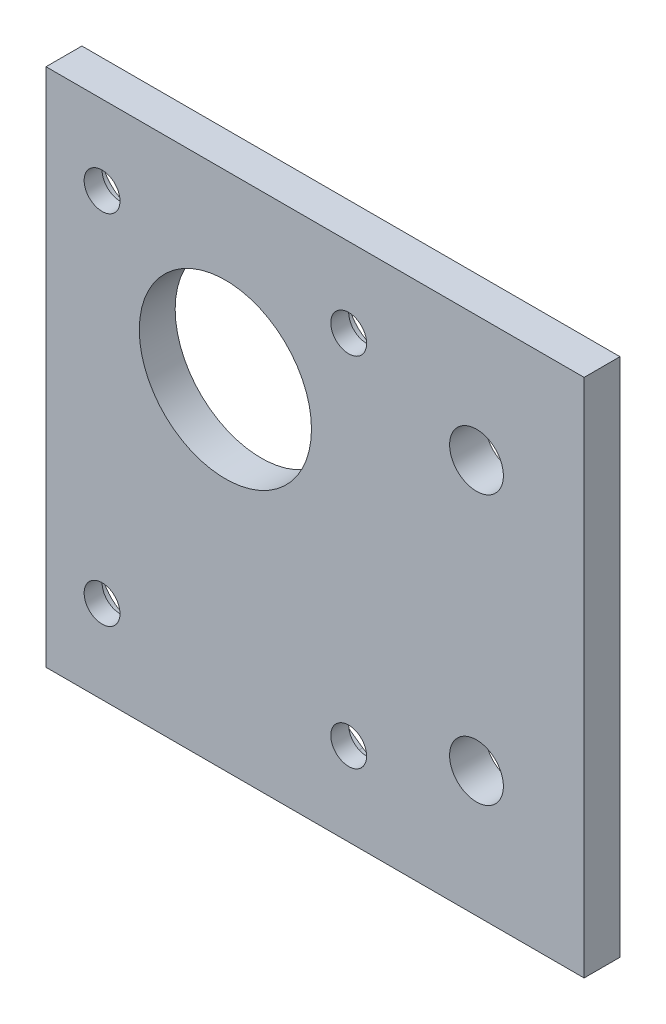
ISO-10303-21;
HEADER;
FILE_DESCRIPTION(('STEP AP214'),'2;1');
FILE_NAME('part.step','',(''),(''),'','','');
FILE_SCHEMA(('AUTOMOTIVE_DESIGN { 1 0 10303 214 1 1 1 1 }'));
ENDSEC;
DATA;
#1=APPLICATION_CONTEXT('core data for automotive mechanical design processes');
#2=APPLICATION_PROTOCOL_DEFINITION('international standard','automotive_design',2000,#1);
#3=PRODUCT_CONTEXT('',#1,'mechanical');
#4=PRODUCT('Part','Part','',(#3));
#5=PRODUCT_RELATED_PRODUCT_CATEGORY('part','',(#4));
#6=PRODUCT_DEFINITION_FORMATION('','',#4);
#7=PRODUCT_DEFINITION_CONTEXT('part definition',#1,'design');
#8=PRODUCT_DEFINITION('design','',#6,#7);
#9=PRODUCT_DEFINITION_SHAPE('','',#8);
#10=(LENGTH_UNIT() NAMED_UNIT(*) SI_UNIT(.MILLI.,.METRE.));
#11=(NAMED_UNIT(*) PLANE_ANGLE_UNIT() SI_UNIT($,.RADIAN.));
#12=(NAMED_UNIT(*) SI_UNIT($,.STERADIAN.) SOLID_ANGLE_UNIT());
#13=UNCERTAINTY_MEASURE_WITH_UNIT(LENGTH_MEASURE(1.E-05),#10,'distance_accuracy_value','');
#14=(GEOMETRIC_REPRESENTATION_CONTEXT(3) GLOBAL_UNCERTAINTY_ASSIGNED_CONTEXT((#13)) GLOBAL_UNIT_ASSIGNED_CONTEXT((#10,
#11,#12)) REPRESENTATION_CONTEXT('',''));
#15=CARTESIAN_POINT('',(0.,0.,0.));
#16=DIRECTION('',(0.,0.,1.));
#17=DIRECTION('',(1.,0.,0.));
#18=AXIS2_PLACEMENT_3D('',#15,#16,#17);
#19=CARTESIAN_POINT('',(0.,-29.,2.));
#20=DIRECTION('',(0.,-1.,0.));
#21=DIRECTION('',(0.,0.,-1.));
#22=AXIS2_PLACEMENT_3D('',#19,#20,#21);
#23=PLANE('',#22);
#24=DIRECTION('',(-1.,0.,0.));
#25=VECTOR('',#24,1.);
#26=CARTESIAN_POINT('',(0.,-29.,0.));
#27=LINE('',#26,#25);
#28=CARTESIAN_POINT('',(40.,-29.,0.));
#29=VERTEX_POINT('',#28);
#30=CARTESIAN_POINT('',(-20.,-29.,0.));
#31=VERTEX_POINT('',#30);
#32=EDGE_CURVE('E115',#29,#31,#27,.T.);
#33=ORIENTED_EDGE('',*,*,#32,.F.);
#34=DIRECTION('',(0.,0.,-1.));
#35=VECTOR('',#34,1.);
#36=CARTESIAN_POINT('',(40.,-29.,2.));
#37=LINE('',#36,#35);
#38=CARTESIAN_POINT('',(40.,-29.,4.));
#39=VERTEX_POINT('',#38);
#40=EDGE_CURVE('E11',#39,#29,#37,.T.);
#41=ORIENTED_EDGE('',*,*,#40,.F.);
#42=DIRECTION('',(1.,0.,0.));
#43=VECTOR('',#42,1.);
#44=CARTESIAN_POINT('',(-20.,-29.,4.));
#45=LINE('',#44,#43);
#46=CARTESIAN_POINT('',(-20.,-29.,4.));
#47=VERTEX_POINT('',#46);
#48=EDGE_CURVE('E114',#47,#39,#45,.T.);
#49=ORIENTED_EDGE('',*,*,#48,.F.);
#50=DIRECTION('',(0.,0.,-1.));
#51=VECTOR('',#50,1.);
#52=CARTESIAN_POINT('',(-20.,-29.,2.));
#53=LINE('',#52,#51);
#54=EDGE_CURVE('E94',#47,#31,#53,.T.);
#55=ORIENTED_EDGE('',*,*,#54,.T.);
#56=EDGE_LOOP('',(#33,#41,#49,#55));
#57=FACE_BOUND('',#56,.T.);
#58=ADVANCED_FACE('F39',(#57),#23,.T.);
#59=CARTESIAN_POINT('',(40.,0.,2.));
#60=DIRECTION('',(1.,0.,0.));
#61=DIRECTION('',(0.,1.,0.));
#62=AXIS2_PLACEMENT_3D('',#59,#60,#61);
#63=PLANE('',#62);
#64=DIRECTION('',(0.,-1.,0.));
#65=VECTOR('',#64,1.);
#66=CARTESIAN_POINT('',(40.,0.,0.));
#67=LINE('',#66,#65);
#68=CARTESIAN_POINT('',(40.,29.,0.));
#69=VERTEX_POINT('',#68);
#70=EDGE_CURVE('E197',#69,#29,#67,.T.);
#71=ORIENTED_EDGE('',*,*,#70,.F.);
#72=DIRECTION('',(0.,0.,-1.));
#73=VECTOR('',#72,1.);
#74=CARTESIAN_POINT('',(40.,29.,2.));
#75=LINE('',#74,#73);
#76=CARTESIAN_POINT('',(40.,29.,4.));
#77=VERTEX_POINT('',#76);
#78=EDGE_CURVE('E49',#77,#69,#75,.T.);
#79=ORIENTED_EDGE('',*,*,#78,.F.);
#80=DIRECTION('',(0.,1.,0.));
#81=VECTOR('',#80,1.);
#82=CARTESIAN_POINT('',(40.,-29.,4.));
#83=LINE('',#82,#81);
#84=EDGE_CURVE('E120',#39,#77,#83,.T.);
#85=ORIENTED_EDGE('',*,*,#84,.F.);
#86=ORIENTED_EDGE('',*,*,#40,.T.);
#87=EDGE_LOOP('',(#71,#79,#85,#86));
#88=FACE_BOUND('',#87,.T.);
#89=ADVANCED_FACE('F121',(#88),#63,.T.);
#90=CARTESIAN_POINT('',(0.,29.,2.));
#91=DIRECTION('',(0.,1.,0.));
#92=DIRECTION('',(-1.,0.,0.));
#93=AXIS2_PLACEMENT_3D('',#90,#91,#92);
#94=PLANE('',#93);
#95=DIRECTION('',(1.,0.,0.));
#96=VECTOR('',#95,1.);
#97=CARTESIAN_POINT('',(0.,29.,0.));
#98=LINE('',#97,#96);
#99=CARTESIAN_POINT('',(-20.,29.,0.));
#100=VERTEX_POINT('',#99);
#101=EDGE_CURVE('E199',#100,#69,#98,.T.);
#102=ORIENTED_EDGE('',*,*,#101,.F.);
#103=DIRECTION('',(0.,0.,-1.));
#104=VECTOR('',#103,1.);
#105=CARTESIAN_POINT('',(-20.,29.,2.));
#106=LINE('',#105,#104);
#107=CARTESIAN_POINT('',(-20.,29.,4.));
#108=VERTEX_POINT('',#107);
#109=EDGE_CURVE('E87',#108,#100,#106,.T.);
#110=ORIENTED_EDGE('',*,*,#109,.F.);
#111=DIRECTION('',(-1.,0.,0.));
#112=VECTOR('',#111,1.);
#113=CARTESIAN_POINT('',(-20.,29.,4.));
#114=LINE('',#113,#112);
#115=EDGE_CURVE('E125',#77,#108,#114,.T.);
#116=ORIENTED_EDGE('',*,*,#115,.F.);
#117=ORIENTED_EDGE('',*,*,#78,.T.);
#118=EDGE_LOOP('',(#102,#110,#116,#117));
#119=FACE_BOUND('',#118,.T.);
#120=ADVANCED_FACE('F238',(#119),#94,.T.);
#121=CARTESIAN_POINT('',(9.67691762911674,-16.8,2.));
#122=DIRECTION('',(0.,0.,-1.));
#123=DIRECTION('',(-1.,0.,0.));
#124=AXIS2_PLACEMENT_3D('',#121,#122,#123);
#125=CYLINDRICAL_SURFACE('',#124,4.2);
#126=CARTESIAN_POINT('',(9.67691762911674,-16.8,0.));
#127=DIRECTION('',(0.,0.,1.));
#128=DIRECTION('',(1.,0.,0.));
#129=AXIS2_PLACEMENT_3D('',#126,#127,#128);
#130=CIRCLE('',#129,4.2);
#131=CARTESIAN_POINT('',(12.1129176291167,-13.378610808458,0.));
#132=VERTEX_POINT('',#131);
#133=CARTESIAN_POINT('',(7.24091762911674,-20.2213891915419,0.));
#134=VERTEX_POINT('',#133);
#135=EDGE_CURVE('E175',#132,#134,#130,.T.);
#136=ORIENTED_EDGE('',*,*,#135,.F.);
#137=DIRECTION('',(0.,0.,-1.));
#138=VECTOR('',#137,1.);
#139=CARTESIAN_POINT('',(12.1129176291167,-13.378610808458,2.));
#140=LINE('',#139,#138);
#141=CARTESIAN_POINT('',(12.1129176291167,-13.378610808458,2.));
#142=VERTEX_POINT('',#141);
#143=EDGE_CURVE('E43',#142,#132,#140,.T.);
#144=ORIENTED_EDGE('',*,*,#143,.F.);
#145=CARTESIAN_POINT('',(9.67691762911674,-16.8,2.));
#146=DIRECTION('',(0.,0.,1.));
#147=DIRECTION('',(1.,0.,0.));
#148=AXIS2_PLACEMENT_3D('',#145,#146,#147);
#149=CIRCLE('',#148,4.2);
#150=CARTESIAN_POINT('',(7.24091762911674,-20.2213891915419,2.));
#151=VERTEX_POINT('',#150);
#152=EDGE_CURVE('E149',#142,#151,#149,.T.);
#153=ORIENTED_EDGE('',*,*,#152,.T.);
#154=DIRECTION('',(0.,0.,-1.));
#155=VECTOR('',#154,1.);
#156=CARTESIAN_POINT('',(7.24091762911674,-20.2213891915419,2.));
#157=LINE('',#156,#155);
#158=EDGE_CURVE('E159',#151,#134,#157,.T.);
#159=ORIENTED_EDGE('',*,*,#158,.T.);
#160=EDGE_LOOP('',(#136,#144,#153,#159));
#161=FACE_BOUND('',#160,.T.);
#162=ADVANCED_FACE('F214',(#161),#125,.F.);
#163=CARTESIAN_POINT('',(-2.24630783394243,-3.15496442689926,2.));
#164=DIRECTION('',(-0.58,-0.814616474176652,0.));
#165=DIRECTION('',(0.814616474176652,-0.58,0.));
#166=AXIS2_PLACEMENT_3D('',#163,#164,#165);
#167=PLANE('',#166);
#168=DIRECTION('',(-0.814616474176652,0.58,0.));
#169=VECTOR('',#168,1.);
#170=CARTESIAN_POINT('',(-2.24630783394243,-3.15496442689926,0.));
#171=LINE('',#170,#169);
#172=CARTESIAN_POINT('',(16.186,-16.2786108084581,0.));
#173=VERTEX_POINT('',#172);
#174=EDGE_CURVE('E178',#173,#132,#171,.T.);
#175=ORIENTED_EDGE('',*,*,#174,.F.);
#176=DIRECTION('',(0.,0.,-1.));
#177=VECTOR('',#176,1.);
#178=CARTESIAN_POINT('',(16.186,-16.2786108084581,2.));
#179=LINE('',#178,#177);
#180=CARTESIAN_POINT('',(16.186,-16.2786108084581,2.));
#181=VERTEX_POINT('',#180);
#182=EDGE_CURVE('E208',#181,#173,#179,.T.);
#183=ORIENTED_EDGE('',*,*,#182,.F.);
#184=DIRECTION('',(-0.814616474176652,0.58,0.));
#185=VECTOR('',#184,1.);
#186=CARTESIAN_POINT('',(-2.24630783394243,-3.15496442689926,2.));
#187=LINE('',#186,#185);
#188=EDGE_CURVE('E151',#181,#142,#187,.T.);
#189=ORIENTED_EDGE('',*,*,#188,.T.);
#190=ORIENTED_EDGE('',*,*,#143,.T.);
#191=EDGE_LOOP('',(#175,#183,#189,#190));
#192=FACE_BOUND('',#191,.T.);
#193=ADVANCED_FACE('F211',(#192),#167,.T.);
#194=CARTESIAN_POINT('',(13.75,-19.7,2.));
#195=DIRECTION('',(0.,0.,-1.));
#196=DIRECTION('',(-1.,0.,0.));
#197=AXIS2_PLACEMENT_3D('',#194,#195,#196);
#198=CYLINDRICAL_SURFACE('',#197,4.2);
#199=CARTESIAN_POINT('',(13.75,-19.7,0.));
#200=DIRECTION('',(0.,0.,1.));
#201=DIRECTION('',(1.,0.,0.));
#202=AXIS2_PLACEMENT_3D('',#199,#200,#201);
#203=CIRCLE('',#202,4.2);
#204=CARTESIAN_POINT('',(11.314,-23.1213891915419,0.));
#205=VERTEX_POINT('',#204);
#206=EDGE_CURVE('E181',#205,#173,#203,.T.);
#207=ORIENTED_EDGE('',*,*,#206,.F.);
#208=DIRECTION('',(0.,0.,-1.));
#209=VECTOR('',#208,1.);
#210=CARTESIAN_POINT('',(11.314,-23.1213891915419,2.));
#211=LINE('',#210,#209);
#212=CARTESIAN_POINT('',(11.314,-23.1213891915419,2.));
#213=VERTEX_POINT('',#212);
#214=EDGE_CURVE('E58',#213,#205,#211,.T.);
#215=ORIENTED_EDGE('',*,*,#214,.F.);
#216=CARTESIAN_POINT('',(13.75,-19.7,2.));
#217=DIRECTION('',(0.,0.,1.));
#218=DIRECTION('',(1.,0.,0.));
#219=AXIS2_PLACEMENT_3D('',#216,#217,#218);
#220=CIRCLE('',#219,4.2);
#221=EDGE_CURVE('E154',#213,#181,#220,.T.);
#222=ORIENTED_EDGE('',*,*,#221,.T.);
#223=ORIENTED_EDGE('',*,*,#182,.T.);
#224=EDGE_LOOP('',(#207,#215,#222,#223));
#225=FACE_BOUND('',#224,.T.);
#226=ADVANCED_FACE('F220',(#225),#198,.F.);
#227=CARTESIAN_POINT('',(-13.75,20.15,2.));
#228=DIRECTION('',(0.,0.,-1.));
#229=DIRECTION('',(-1.,0.,0.));
#230=AXIS2_PLACEMENT_3D('',#227,#228,#229);
#231=CYLINDRICAL_SURFACE('',#230,4.2);
#232=CARTESIAN_POINT('',(-13.75,20.15,2.));
#233=DIRECTION('',(0.,0.,1.));
#234=DIRECTION('',(1.,0.,0.));
#235=AXIS2_PLACEMENT_3D('',#232,#233,#234);
#236=CIRCLE('',#235,4.2);
#237=CARTESIAN_POINT('',(-9.55,20.15,2.));
#238=VERTEX_POINT('',#237);
#239=EDGE_CURVE('E140',#238,#238,#236,.T.);
#240=ORIENTED_EDGE('',*,*,#239,.T.);
#241=EDGE_LOOP('',(#240));
#242=FACE_BOUND('',#241,.T.);
#243=CARTESIAN_POINT('',(-13.75,20.15,0.));
#244=DIRECTION('',(0.,0.,1.));
#245=DIRECTION('',(1.,0.,0.));
#246=AXIS2_PLACEMENT_3D('',#243,#244,#245);
#247=CIRCLE('',#246,4.2);
#248=CARTESIAN_POINT('',(-9.55,20.15,0.));
#249=VERTEX_POINT('',#248);
#250=EDGE_CURVE('E193',#249,#249,#247,.T.);
#251=ORIENTED_EDGE('',*,*,#250,.F.);
#252=EDGE_LOOP('',(#251));
#253=FACE_BOUND('',#252,.T.);
#254=ADVANCED_FACE('F222',(#242,#253),#231,.F.);
#255=CARTESIAN_POINT('',(13.75,20.15,2.));
#256=DIRECTION('',(0.,0.,-1.));
#257=DIRECTION('',(-1.,0.,0.));
#258=AXIS2_PLACEMENT_3D('',#255,#256,#257);
#259=CYLINDRICAL_SURFACE('',#258,4.19999999999999);
#260=CARTESIAN_POINT('',(13.75,20.15,2.));
#261=DIRECTION('',(0.,0.,1.));
#262=DIRECTION('',(1.,0.,0.));
#263=AXIS2_PLACEMENT_3D('',#260,#261,#262);
#264=CIRCLE('',#263,4.19999999999999);
#265=CARTESIAN_POINT('',(17.95,20.15,2.));
#266=VERTEX_POINT('',#265);
#267=EDGE_CURVE('E162',#266,#266,#264,.T.);
#268=ORIENTED_EDGE('',*,*,#267,.T.);
#269=EDGE_LOOP('',(#268));
#270=FACE_BOUND('',#269,.T.);
#271=CARTESIAN_POINT('',(13.75,20.15,0.));
#272=DIRECTION('',(0.,0.,1.));
#273=DIRECTION('',(1.,0.,0.));
#274=AXIS2_PLACEMENT_3D('',#271,#272,#273);
#275=CIRCLE('',#274,4.19999999999999);
#276=CARTESIAN_POINT('',(17.95,20.15,0.));
#277=VERTEX_POINT('',#276);
#278=EDGE_CURVE('E190',#277,#277,#275,.T.);
#279=ORIENTED_EDGE('',*,*,#278,.F.);
#280=EDGE_LOOP('',(#279));
#281=FACE_BOUND('',#280,.T.);
#282=ADVANCED_FACE('F228',(#270,#281),#259,.F.);
#283=CARTESIAN_POINT('',(-13.75,-19.7,2.));
#284=DIRECTION('',(0.,0.,-1.));
#285=DIRECTION('',(-1.,0.,0.));
#286=AXIS2_PLACEMENT_3D('',#283,#284,#285);
#287=CYLINDRICAL_SURFACE('',#286,4.2);
#288=CARTESIAN_POINT('',(-13.75,-19.7,2.));
#289=DIRECTION('',(0.,0.,1.));
#290=DIRECTION('',(1.,0.,0.));
#291=AXIS2_PLACEMENT_3D('',#288,#289,#290);
#292=CIRCLE('',#291,4.2);
#293=CARTESIAN_POINT('',(-9.55,-19.7,2.));
#294=VERTEX_POINT('',#293);
#295=EDGE_CURVE('E148',#294,#294,#292,.T.);
#296=ORIENTED_EDGE('',*,*,#295,.T.);
#297=EDGE_LOOP('',(#296));
#298=FACE_BOUND('',#297,.T.);
#299=CARTESIAN_POINT('',(-13.75,-19.7,0.));
#300=DIRECTION('',(0.,0.,1.));
#301=DIRECTION('',(1.,0.,0.));
#302=AXIS2_PLACEMENT_3D('',#299,#300,#301);
#303=CIRCLE('',#302,4.2);
#304=CARTESIAN_POINT('',(-9.55,-19.7,0.));
#305=VERTEX_POINT('',#304);
#306=EDGE_CURVE('E187',#305,#305,#303,.T.);
#307=ORIENTED_EDGE('',*,*,#306,.F.);
#308=EDGE_LOOP('',(#307));
#309=FACE_BOUND('',#308,.T.);
#310=ADVANCED_FACE('F244',(#298,#309),#287,.F.);
#311=CARTESIAN_POINT('',(-7.11830783394242,-9.99774280998307,2.));
#312=DIRECTION('',(-0.580000000000002,-0.81461647417665,0.));
#313=DIRECTION('',(0.814616474176651,-0.580000000000002,0.));
#314=AXIS2_PLACEMENT_3D('',#311,#312,#313);
#315=PLANE('',#314);
#316=DIRECTION('',(-0.814616474176651,0.580000000000002,0.));
#317=VECTOR('',#316,1.);
#318=CARTESIAN_POINT('',(-7.11830783394242,-9.99774280998307,0.));
#319=LINE('',#318,#317);
#320=EDGE_CURVE('E184',#205,#134,#319,.T.);
#321=ORIENTED_EDGE('',*,*,#320,.T.);
#322=ORIENTED_EDGE('',*,*,#158,.F.);
#323=DIRECTION('',(-0.814616474176651,0.580000000000002,0.));
#324=VECTOR('',#323,1.);
#325=CARTESIAN_POINT('',(-7.11830783394242,-9.99774280998307,2.));
#326=LINE('',#325,#324);
#327=EDGE_CURVE('E156',#213,#151,#326,.T.);
#328=ORIENTED_EDGE('',*,*,#327,.F.);
#329=ORIENTED_EDGE('',*,*,#214,.T.);
#330=EDGE_LOOP('',(#321,#322,#328,#329));
#331=FACE_BOUND('',#330,.T.);
#332=ADVANCED_FACE('F247',(#331),#315,.F.);
#333=CARTESIAN_POINT('',(0.,8.80000000000001,2.));
#334=DIRECTION('',(0.,0.,-1.));
#335=DIRECTION('',(-1.,0.,0.));
#336=AXIS2_PLACEMENT_3D('',#333,#334,#335);
#337=CYLINDRICAL_SURFACE('',#336,9.6);
#338=CARTESIAN_POINT('',(0.,8.80000000000001,0.));
#339=DIRECTION('',(0.,0.,1.));
#340=DIRECTION('',(1.,0.,0.));
#341=AXIS2_PLACEMENT_3D('',#338,#339,#340);
#342=CIRCLE('',#341,9.6);
#343=CARTESIAN_POINT('',(9.6,8.80000000000001,0.));
#344=VERTEX_POINT('',#343);
#345=EDGE_CURVE('E172',#344,#344,#342,.T.);
#346=ORIENTED_EDGE('',*,*,#345,.F.);
#347=EDGE_LOOP('',(#346));
#348=FACE_BOUND('',#347,.T.);
#349=CARTESIAN_POINT('',(0.,8.80000000000001,4.));
#350=DIRECTION('',(0.,0.,1.));
#351=DIRECTION('',(1.,0.,0.));
#352=AXIS2_PLACEMENT_3D('',#349,#350,#351);
#353=CIRCLE('',#352,9.6);
#354=CARTESIAN_POINT('',(9.6,8.80000000000001,4.));
#355=VERTEX_POINT('',#354);
#356=EDGE_CURVE('E312',#355,#355,#353,.T.);
#357=ORIENTED_EDGE('',*,*,#356,.T.);
#358=EDGE_LOOP('',(#357));
#359=FACE_BOUND('',#358,.T.);
#360=ADVANCED_FACE('F250',(#348,#359),#337,.F.);
#361=CARTESIAN_POINT('',(-5.725,-6.09999999999999,2.));
#362=DIRECTION('',(0.,0.,-1.));
#363=DIRECTION('',(-1.,0.,0.));
#364=AXIS2_PLACEMENT_3D('',#361,#362,#363);
#365=CYLINDRICAL_SURFACE('',#364,4.2);
#366=CARTESIAN_POINT('',(-5.725,-6.09999999999999,2.));
#367=DIRECTION('',(0.,0.,1.));
#368=DIRECTION('',(1.,0.,0.));
#369=AXIS2_PLACEMENT_3D('',#366,#367,#368);
#370=CIRCLE('',#369,4.2);
#371=CARTESIAN_POINT('',(-1.525,-6.09999999999999,2.));
#372=VERTEX_POINT('',#371);
#373=EDGE_CURVE('E145',#372,#372,#370,.T.);
#374=ORIENTED_EDGE('',*,*,#373,.T.);
#375=EDGE_LOOP('',(#374));
#376=FACE_BOUND('',#375,.T.);
#377=CARTESIAN_POINT('',(-5.725,-6.09999999999999,0.));
#378=DIRECTION('',(0.,0.,1.));
#379=DIRECTION('',(1.,0.,0.));
#380=AXIS2_PLACEMENT_3D('',#377,#378,#379);
#381=CIRCLE('',#380,4.2);
#382=CARTESIAN_POINT('',(-1.525,-6.09999999999999,0.));
#383=VERTEX_POINT('',#382);
#384=EDGE_CURVE('E169',#383,#383,#381,.T.);
#385=ORIENTED_EDGE('',*,*,#384,.F.);
#386=EDGE_LOOP('',(#385));
#387=FACE_BOUND('',#386,.T.);
#388=ADVANCED_FACE('F255',(#376,#387),#365,.F.);
#389=CARTESIAN_POINT('',(5.725,-6.09999999999999,2.));
#390=DIRECTION('',(0.,0.,-1.));
#391=DIRECTION('',(-1.,0.,0.));
#392=AXIS2_PLACEMENT_3D('',#389,#390,#391);
#393=CYLINDRICAL_SURFACE('',#392,4.2);
#394=CARTESIAN_POINT('',(5.725,-6.09999999999999,2.));
#395=DIRECTION('',(0.,0.,1.));
#396=DIRECTION('',(1.,0.,0.));
#397=AXIS2_PLACEMENT_3D('',#394,#395,#396);
#398=CIRCLE('',#397,4.2);
#399=CARTESIAN_POINT('',(9.925,-6.09999999999999,2.));
#400=VERTEX_POINT('',#399);
#401=EDGE_CURVE('E141',#400,#400,#398,.T.);
#402=ORIENTED_EDGE('',*,*,#401,.T.);
#403=EDGE_LOOP('',(#402));
#404=FACE_BOUND('',#403,.T.);
#405=CARTESIAN_POINT('',(5.725,-6.09999999999999,0.));
#406=DIRECTION('',(0.,0.,1.));
#407=DIRECTION('',(1.,0.,0.));
#408=AXIS2_PLACEMENT_3D('',#405,#406,#407);
#409=CIRCLE('',#408,4.2);
#410=CARTESIAN_POINT('',(9.925,-6.09999999999999,0.));
#411=VERTEX_POINT('',#410);
#412=EDGE_CURVE('E144',#411,#411,#409,.T.);
#413=ORIENTED_EDGE('',*,*,#412,.F.);
#414=EDGE_LOOP('',(#413));
#415=FACE_BOUND('',#414,.T.);
#416=ADVANCED_FACE('F41',(#404,#415),#393,.F.);
#417=CARTESIAN_POINT('',(-20.,0.,2.));
#418=DIRECTION('',(-1.,0.,0.));
#419=DIRECTION('',(0.,0.,1.));
#420=AXIS2_PLACEMENT_3D('',#417,#418,#419);
#421=PLANE('',#420);
#422=DIRECTION('',(0.,1.,0.));
#423=VECTOR('',#422,1.);
#424=CARTESIAN_POINT('',(-20.,0.,0.));
#425=LINE('',#424,#423);
#426=EDGE_CURVE('E152',#31,#100,#425,.T.);
#427=ORIENTED_EDGE('',*,*,#426,.F.);
#428=ORIENTED_EDGE('',*,*,#54,.F.);
#429=DIRECTION('',(0.,-1.,0.));
#430=VECTOR('',#429,1.);
#431=CARTESIAN_POINT('',(-20.,29.,4.));
#432=LINE('',#431,#430);
#433=EDGE_CURVE('E130',#108,#47,#432,.T.);
#434=ORIENTED_EDGE('',*,*,#433,.F.);
#435=ORIENTED_EDGE('',*,*,#109,.T.);
#436=EDGE_LOOP('',(#427,#428,#434,#435));
#437=FACE_BOUND('',#436,.T.);
#438=ADVANCED_FACE('F285',(#437),#421,.T.);
#439=CARTESIAN_POINT('',(0.,0.,0.));
#440=DIRECTION('',(0.,0.,1.));
#441=DIRECTION('',(1.,0.,0.));
#442=AXIS2_PLACEMENT_3D('',#439,#440,#441);
#443=PLANE('',#442);
#444=CARTESIAN_POINT('',(28.,15.,0.));
#445=DIRECTION('',(0.,0.,1.));
#446=DIRECTION('',(1.,0.,0.));
#447=AXIS2_PLACEMENT_3D('',#444,#445,#446);
#448=CIRCLE('',#447,3.);
#449=CARTESIAN_POINT('',(31.,15.,0.));
#450=VERTEX_POINT('',#449);
#451=EDGE_CURVE('E315',#450,#450,#448,.F.);
#452=ORIENTED_EDGE('',*,*,#451,.F.);
#453=EDGE_LOOP('',(#452));
#454=FACE_BOUND('',#453,.T.);
#455=CARTESIAN_POINT('',(28.,-15.,0.));
#456=DIRECTION('',(0.,0.,1.));
#457=DIRECTION('',(1.,0.,0.));
#458=AXIS2_PLACEMENT_3D('',#455,#456,#457);
#459=CIRCLE('',#458,3.);
#460=CARTESIAN_POINT('',(31.,-15.,0.));
#461=VERTEX_POINT('',#460);
#462=EDGE_CURVE('E324',#461,#461,#459,.F.);
#463=ORIENTED_EDGE('',*,*,#462,.F.);
#464=EDGE_LOOP('',(#463));
#465=FACE_BOUND('',#464,.T.);
#466=ORIENTED_EDGE('',*,*,#412,.T.);
#467=EDGE_LOOP('',(#466));
#468=FACE_BOUND('',#467,.T.);
#469=ORIENTED_EDGE('',*,*,#384,.T.);
#470=EDGE_LOOP('',(#469));
#471=FACE_BOUND('',#470,.T.);
#472=ORIENTED_EDGE('',*,*,#345,.T.);
#473=EDGE_LOOP('',(#472));
#474=FACE_BOUND('',#473,.T.);
#475=ORIENTED_EDGE('',*,*,#135,.T.);
#476=ORIENTED_EDGE('',*,*,#320,.F.);
#477=ORIENTED_EDGE('',*,*,#206,.T.);
#478=ORIENTED_EDGE('',*,*,#174,.T.);
#479=EDGE_LOOP('',(#475,#476,#477,#478));
#480=FACE_BOUND('',#479,.T.);
#481=ORIENTED_EDGE('',*,*,#306,.T.);
#482=EDGE_LOOP('',(#481));
#483=FACE_BOUND('',#482,.T.);
#484=ORIENTED_EDGE('',*,*,#278,.T.);
#485=EDGE_LOOP('',(#484));
#486=FACE_BOUND('',#485,.T.);
#487=ORIENTED_EDGE('',*,*,#250,.T.);
#488=EDGE_LOOP('',(#487));
#489=FACE_BOUND('',#488,.T.);
#490=ORIENTED_EDGE('',*,*,#32,.T.);
#491=ORIENTED_EDGE('',*,*,#426,.T.);
#492=ORIENTED_EDGE('',*,*,#101,.T.);
#493=ORIENTED_EDGE('',*,*,#70,.T.);
#494=EDGE_LOOP('',(#490,#491,#492,#493));
#495=FACE_BOUND('',#494,.T.);
#496=ADVANCED_FACE('F218',(#454,#465,#468,#471,#474,#480,#483,#486,#489,#495),#443,.F.);
#497=CARTESIAN_POINT('',(13.75,-19.7,4.));
#498=DIRECTION('',(0.,0.,-1.));
#499=DIRECTION('',(-1.,0.,0.));
#500=AXIS2_PLACEMENT_3D('',#497,#498,#499);
#501=CYLINDRICAL_SURFACE('',#500,2.00000000000001);
#502=CARTESIAN_POINT('',(13.75,-19.7,4.));
#503=DIRECTION('',(0.,0.,1.));
#504=DIRECTION('',(1.,0.,0.));
#505=AXIS2_PLACEMENT_3D('',#502,#503,#504);
#506=CIRCLE('',#505,2.00000000000001);
#507=CARTESIAN_POINT('',(15.75,-19.7,4.));
#508=VERTEX_POINT('',#507);
#509=EDGE_CURVE('E317',#508,#508,#506,.T.);
#510=ORIENTED_EDGE('',*,*,#509,.T.);
#511=EDGE_LOOP('',(#510));
#512=FACE_BOUND('',#511,.T.);
#513=CARTESIAN_POINT('',(13.75,-19.7,2.));
#514=DIRECTION('',(0.,0.,1.));
#515=DIRECTION('',(1.,0.,0.));
#516=AXIS2_PLACEMENT_3D('',#513,#514,#515);
#517=CIRCLE('',#516,2.00000000000001);
#518=CARTESIAN_POINT('',(15.75,-19.7,2.));
#519=VERTEX_POINT('',#518);
#520=EDGE_CURVE('E314',#519,#519,#517,.T.);
#521=ORIENTED_EDGE('',*,*,#520,.F.);
#522=EDGE_LOOP('',(#521));
#523=FACE_BOUND('',#522,.T.);
#524=ADVANCED_FACE('F284',(#512,#523),#501,.F.);
#525=CARTESIAN_POINT('',(13.75,20.15,4.));
#526=DIRECTION('',(0.,0.,-1.));
#527=DIRECTION('',(-1.,0.,0.));
#528=AXIS2_PLACEMENT_3D('',#525,#526,#527);
#529=CYLINDRICAL_SURFACE('',#528,2.);
#530=CARTESIAN_POINT('',(13.75,20.15,4.));
#531=DIRECTION('',(0.,0.,1.));
#532=DIRECTION('',(1.,0.,0.));
#533=AXIS2_PLACEMENT_3D('',#530,#531,#532);
#534=CIRCLE('',#533,2.);
#535=CARTESIAN_POINT('',(15.75,20.15,4.));
#536=VERTEX_POINT('',#535);
#537=EDGE_CURVE('E329',#536,#536,#534,.T.);
#538=ORIENTED_EDGE('',*,*,#537,.T.);
#539=EDGE_LOOP('',(#538));
#540=FACE_BOUND('',#539,.T.);
#541=CARTESIAN_POINT('',(13.75,20.15,2.));
#542=DIRECTION('',(0.,0.,1.));
#543=DIRECTION('',(1.,0.,0.));
#544=AXIS2_PLACEMENT_3D('',#541,#542,#543);
#545=CIRCLE('',#544,2.);
#546=CARTESIAN_POINT('',(15.75,20.15,2.));
#547=VERTEX_POINT('',#546);
#548=EDGE_CURVE('E327',#547,#547,#545,.T.);
#549=ORIENTED_EDGE('',*,*,#548,.F.);
#550=EDGE_LOOP('',(#549));
#551=FACE_BOUND('',#550,.T.);
#552=ADVANCED_FACE('F346',(#540,#551),#529,.F.);
#553=CARTESIAN_POINT('',(-13.75,20.15,4.));
#554=DIRECTION('',(0.,0.,-1.));
#555=DIRECTION('',(-1.,0.,0.));
#556=AXIS2_PLACEMENT_3D('',#553,#554,#555);
#557=CYLINDRICAL_SURFACE('',#556,2.);
#558=CARTESIAN_POINT('',(-13.75,20.15,4.));
#559=DIRECTION('',(0.,0.,1.));
#560=DIRECTION('',(1.,0.,0.));
#561=AXIS2_PLACEMENT_3D('',#558,#559,#560);
#562=CIRCLE('',#561,2.);
#563=CARTESIAN_POINT('',(-11.75,20.15,4.));
#564=VERTEX_POINT('',#563);
#565=EDGE_CURVE('E335',#564,#564,#562,.T.);
#566=ORIENTED_EDGE('',*,*,#565,.T.);
#567=EDGE_LOOP('',(#566));
#568=FACE_BOUND('',#567,.T.);
#569=CARTESIAN_POINT('',(-13.75,20.15,2.));
#570=DIRECTION('',(0.,0.,1.));
#571=DIRECTION('',(1.,0.,0.));
#572=AXIS2_PLACEMENT_3D('',#569,#570,#571);
#573=CIRCLE('',#572,2.);
#574=CARTESIAN_POINT('',(-11.75,20.15,2.));
#575=VERTEX_POINT('',#574);
#576=EDGE_CURVE('E332',#575,#575,#573,.T.);
#577=ORIENTED_EDGE('',*,*,#576,.F.);
#578=EDGE_LOOP('',(#577));
#579=FACE_BOUND('',#578,.T.);
#580=ADVANCED_FACE('F343',(#568,#579),#557,.F.);
#581=CARTESIAN_POINT('',(-13.75,-19.7,4.));
#582=DIRECTION('',(0.,0.,-1.));
#583=DIRECTION('',(-1.,0.,0.));
#584=AXIS2_PLACEMENT_3D('',#581,#582,#583);
#585=CYLINDRICAL_SURFACE('',#584,2.);
#586=CARTESIAN_POINT('',(-13.75,-19.7,4.));
#587=DIRECTION('',(0.,0.,1.));
#588=DIRECTION('',(1.,0.,0.));
#589=AXIS2_PLACEMENT_3D('',#586,#587,#588);
#590=CIRCLE('',#589,2.);
#591=CARTESIAN_POINT('',(-11.75,-19.7,4.));
#592=VERTEX_POINT('',#591);
#593=EDGE_CURVE('E131',#592,#592,#590,.T.);
#594=ORIENTED_EDGE('',*,*,#593,.T.);
#595=EDGE_LOOP('',(#594));
#596=FACE_BOUND('',#595,.T.);
#597=CARTESIAN_POINT('',(-13.75,-19.7,2.));
#598=DIRECTION('',(0.,0.,1.));
#599=DIRECTION('',(1.,0.,0.));
#600=AXIS2_PLACEMENT_3D('',#597,#598,#599);
#601=CIRCLE('',#600,2.);
#602=CARTESIAN_POINT('',(-11.75,-19.7,2.));
#603=VERTEX_POINT('',#602);
#604=EDGE_CURVE('E134',#603,#603,#601,.T.);
#605=ORIENTED_EDGE('',*,*,#604,.F.);
#606=EDGE_LOOP('',(#605));
#607=FACE_BOUND('',#606,.T.);
#608=ADVANCED_FACE('F345',(#596,#607),#585,.F.);
#609=CARTESIAN_POINT('',(0.,0.,4.));
#610=DIRECTION('',(0.,0.,1.));
#611=DIRECTION('',(1.,0.,0.));
#612=AXIS2_PLACEMENT_3D('',#609,#610,#611);
#613=PLANE('',#612);
#614=CARTESIAN_POINT('',(28.,15.,4.));
#615=DIRECTION('',(0.,0.,1.));
#616=DIRECTION('',(1.,0.,0.));
#617=AXIS2_PLACEMENT_3D('',#614,#615,#616);
#618=CIRCLE('',#617,3.);
#619=CARTESIAN_POINT('',(31.,15.,4.));
#620=VERTEX_POINT('',#619);
#621=EDGE_CURVE('E320',#620,#620,#618,.T.);
#622=ORIENTED_EDGE('',*,*,#621,.F.);
#623=EDGE_LOOP('',(#622));
#624=FACE_BOUND('',#623,.T.);
#625=CARTESIAN_POINT('',(28.,-15.,4.));
#626=DIRECTION('',(0.,0.,1.));
#627=DIRECTION('',(1.,0.,0.));
#628=AXIS2_PLACEMENT_3D('',#625,#626,#627);
#629=CIRCLE('',#628,3.);
#630=CARTESIAN_POINT('',(31.,-15.,4.));
#631=VERTEX_POINT('',#630);
#632=EDGE_CURVE('E375',#631,#631,#629,.T.);
#633=ORIENTED_EDGE('',*,*,#632,.F.);
#634=EDGE_LOOP('',(#633));
#635=FACE_BOUND('',#634,.T.);
#636=ORIENTED_EDGE('',*,*,#509,.F.);
#637=EDGE_LOOP('',(#636));
#638=FACE_BOUND('',#637,.T.);
#639=ORIENTED_EDGE('',*,*,#565,.F.);
#640=EDGE_LOOP('',(#639));
#641=FACE_BOUND('',#640,.T.);
#642=ORIENTED_EDGE('',*,*,#48,.T.);
#643=ORIENTED_EDGE('',*,*,#84,.T.);
#644=ORIENTED_EDGE('',*,*,#115,.T.);
#645=ORIENTED_EDGE('',*,*,#433,.T.);
#646=EDGE_LOOP('',(#642,#643,#644,#645));
#647=FACE_BOUND('',#646,.T.);
#648=ORIENTED_EDGE('',*,*,#593,.F.);
#649=EDGE_LOOP('',(#648));
#650=FACE_BOUND('',#649,.T.);
#651=ORIENTED_EDGE('',*,*,#537,.F.);
#652=EDGE_LOOP('',(#651));
#653=FACE_BOUND('',#652,.T.);
#654=ORIENTED_EDGE('',*,*,#356,.F.);
#655=EDGE_LOOP('',(#654));
#656=FACE_BOUND('',#655,.T.);
#657=ADVANCED_FACE('F128',(#624,#635,#638,#641,#647,#650,#653,#656),#613,.T.);
#658=CARTESIAN_POINT('',(0.,0.,2.));
#659=DIRECTION('',(0.,0.,1.));
#660=DIRECTION('',(1.,0.,0.));
#661=AXIS2_PLACEMENT_3D('',#658,#659,#660);
#662=PLANE('',#661);
#663=ORIENTED_EDGE('',*,*,#576,.T.);
#664=EDGE_LOOP('',(#663));
#665=FACE_BOUND('',#664,.T.);
#666=ORIENTED_EDGE('',*,*,#239,.F.);
#667=EDGE_LOOP('',(#666));
#668=FACE_BOUND('',#667,.T.);
#669=ADVANCED_FACE('F280',(#665,#668),#662,.F.);
#670=ORIENTED_EDGE('',*,*,#548,.T.);
#671=EDGE_LOOP('',(#670));
#672=FACE_BOUND('',#671,.T.);
#673=ORIENTED_EDGE('',*,*,#267,.F.);
#674=EDGE_LOOP('',(#673));
#675=FACE_BOUND('',#674,.T.);
#676=ADVANCED_FACE('F272',(#672,#675),#662,.F.);
#677=ORIENTED_EDGE('',*,*,#604,.T.);
#678=EDGE_LOOP('',(#677));
#679=FACE_BOUND('',#678,.T.);
#680=ORIENTED_EDGE('',*,*,#295,.F.);
#681=EDGE_LOOP('',(#680));
#682=FACE_BOUND('',#681,.T.);
#683=ADVANCED_FACE('F263',(#679,#682),#662,.F.);
#684=ORIENTED_EDGE('',*,*,#520,.T.);
#685=EDGE_LOOP('',(#684));
#686=FACE_BOUND('',#685,.T.);
#687=ORIENTED_EDGE('',*,*,#152,.F.);
#688=ORIENTED_EDGE('',*,*,#188,.F.);
#689=ORIENTED_EDGE('',*,*,#221,.F.);
#690=ORIENTED_EDGE('',*,*,#327,.T.);
#691=EDGE_LOOP('',(#687,#688,#689,#690));
#692=FACE_BOUND('',#691,.T.);
#693=ADVANCED_FACE('F260',(#686,#692),#662,.F.);
#694=ORIENTED_EDGE('',*,*,#373,.F.);
#695=EDGE_LOOP('',(#694));
#696=FACE_BOUND('',#695,.T.);
#697=ADVANCED_FACE('F262',(#696),#662,.F.);
#698=ORIENTED_EDGE('',*,*,#401,.F.);
#699=EDGE_LOOP('',(#698));
#700=FACE_BOUND('',#699,.T.);
#701=ADVANCED_FACE('F270',(#700),#662,.F.);
#702=CARTESIAN_POINT('',(28.,-15.,-8.48528137423856));
#703=DIRECTION('',(0.,0.,1.));
#704=DIRECTION('',(1.,0.,0.));
#705=AXIS2_PLACEMENT_3D('',#702,#703,#704);
#706=CYLINDRICAL_SURFACE('',#705,3.);
#707=ORIENTED_EDGE('',*,*,#462,.T.);
#708=EDGE_LOOP('',(#707));
#709=FACE_BOUND('',#708,.T.);
#710=ORIENTED_EDGE('',*,*,#632,.T.);
#711=EDGE_LOOP('',(#710));
#712=FACE_BOUND('',#711,.T.);
#713=ADVANCED_FACE('F278',(#709,#712),#706,.F.);
#714=CARTESIAN_POINT('',(28.,15.,-8.48528137423856));
#715=DIRECTION('',(0.,0.,1.));
#716=DIRECTION('',(1.,0.,0.));
#717=AXIS2_PLACEMENT_3D('',#714,#715,#716);
#718=CYLINDRICAL_SURFACE('',#717,3.);
#719=ORIENTED_EDGE('',*,*,#451,.T.);
#720=EDGE_LOOP('',(#719));
#721=FACE_BOUND('',#720,.T.);
#722=ORIENTED_EDGE('',*,*,#621,.T.);
#723=EDGE_LOOP('',(#722));
#724=FACE_BOUND('',#723,.T.);
#725=ADVANCED_FACE('F362',(#721,#724),#718,.F.);
#726=CLOSED_SHELL('',(#58,#89,#120,#162,#193,#226,#254,#282,#310,#332,#360,#388,#416,#438,#496,
#524,#552,#580,#608,#657,#669,#676,#683,#693,#697,#701,#713,#725));
#727=MANIFOLD_SOLID_BREP('B2',#726);
#728=ADVANCED_BREP_SHAPE_REPRESENTATION('',(#18,#727),#14);
#729=SHAPE_DEFINITION_REPRESENTATION(#9,#728);
ENDSEC;
END-ISO-10303-21;
